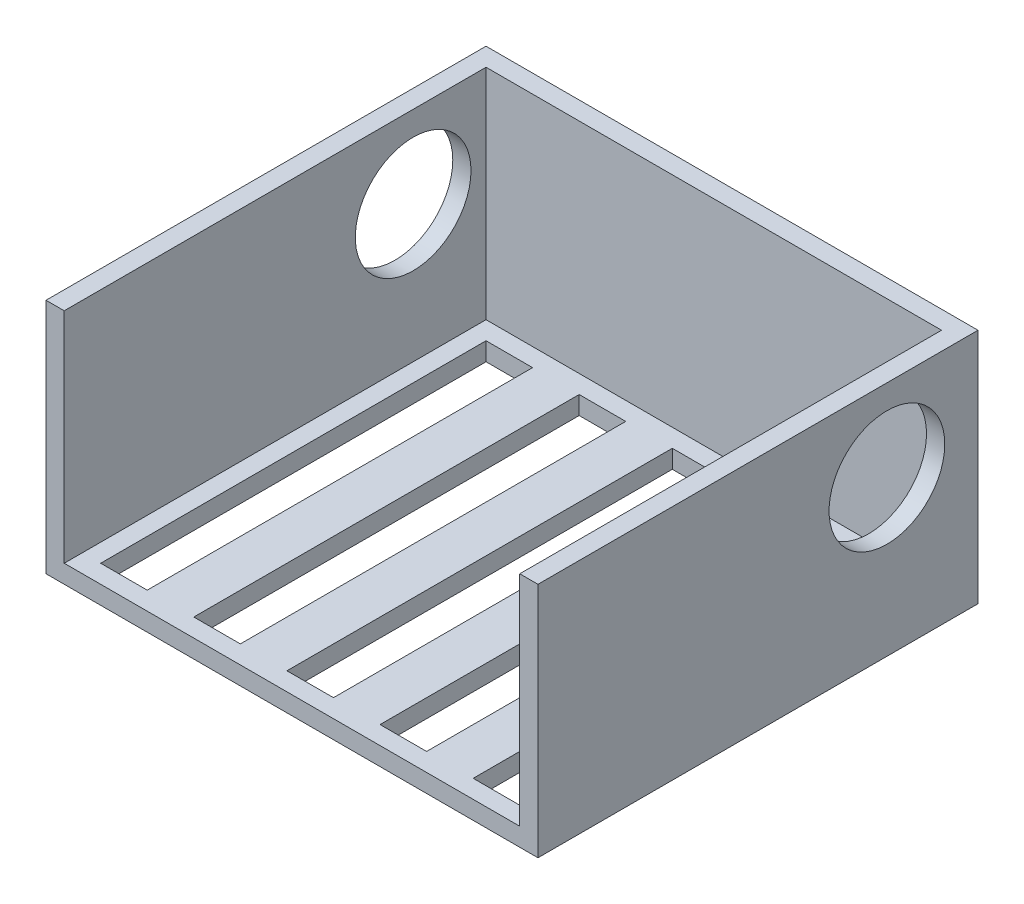
ISO-10303-21;
HEADER;
FILE_DESCRIPTION(('STEP AP214'),'2;1');
FILE_NAME('part.step','',(''),(''),'','','');
FILE_SCHEMA(('AUTOMOTIVE_DESIGN { 1 0 10303 214 1 1 1 1 }'));
ENDSEC;
DATA;
#1=APPLICATION_CONTEXT('core data for automotive mechanical design processes');
#2=APPLICATION_PROTOCOL_DEFINITION('international standard','automotive_design',2000,#1);
#3=PRODUCT_CONTEXT('',#1,'mechanical');
#4=PRODUCT('Part','Part','',(#3));
#5=PRODUCT_RELATED_PRODUCT_CATEGORY('part','',(#4));
#6=PRODUCT_DEFINITION_FORMATION('','',#4);
#7=PRODUCT_DEFINITION_CONTEXT('part definition',#1,'design');
#8=PRODUCT_DEFINITION('design','',#6,#7);
#9=PRODUCT_DEFINITION_SHAPE('','',#8);
#10=(LENGTH_UNIT() NAMED_UNIT(*) SI_UNIT(.MILLI.,.METRE.));
#11=(NAMED_UNIT(*) PLANE_ANGLE_UNIT() SI_UNIT($,.RADIAN.));
#12=(NAMED_UNIT(*) SI_UNIT($,.STERADIAN.) SOLID_ANGLE_UNIT());
#13=UNCERTAINTY_MEASURE_WITH_UNIT(LENGTH_MEASURE(1.E-05),#10,'distance_accuracy_value','');
#14=(GEOMETRIC_REPRESENTATION_CONTEXT(3) GLOBAL_UNCERTAINTY_ASSIGNED_CONTEXT((#13)) GLOBAL_UNIT_ASSIGNED_CONTEXT((#10,
#11,#12)) REPRESENTATION_CONTEXT('',''));
#15=CARTESIAN_POINT('',(0.,0.,0.));
#16=DIRECTION('',(0.,0.,1.));
#17=DIRECTION('',(1.,0.,0.));
#18=AXIS2_PLACEMENT_3D('',#15,#16,#17);
#19=CARTESIAN_POINT('',(0.,0.,0.));
#20=DIRECTION('',(0.,-1.,0.));
#21=DIRECTION('',(0.,0.,-1.));
#22=AXIS2_PLACEMENT_3D('',#19,#20,#21);
#23=PLANE('',#22);
#24=DIRECTION('',(0.,0.,1.));
#25=VECTOR('',#24,1.);
#26=CARTESIAN_POINT('',(-12.2222222222222,0.,0.));
#27=LINE('',#26,#25);
#28=CARTESIAN_POINT('',(-12.2222222222222,0.,2.));
#29=VERTEX_POINT('',#28);
#30=CARTESIAN_POINT('',(-12.2222222222222,0.,44.3));
#31=VERTEX_POINT('',#30);
#32=EDGE_CURVE('E433',#29,#31,#27,.T.);
#33=ORIENTED_EDGE('',*,*,#32,.T.);
#34=DIRECTION('',(1.,0.,0.));
#35=VECTOR('',#34,1.);
#36=CARTESIAN_POINT('',(0.,0.,44.3));
#37=LINE('',#36,#35);
#38=CARTESIAN_POINT('',(-17.3333333333334,0.,44.3));
#39=VERTEX_POINT('',#38);
#40=EDGE_CURVE('E413',#39,#31,#37,.T.);
#41=ORIENTED_EDGE('',*,*,#40,.F.);
#42=DIRECTION('',(0.,0.,1.));
#43=VECTOR('',#42,1.);
#44=CARTESIAN_POINT('',(-17.3333333333334,0.,0.));
#45=LINE('',#44,#43);
#46=CARTESIAN_POINT('',(-17.3333333333334,0.,2.));
#47=VERTEX_POINT('',#46);
#48=EDGE_CURVE('E425',#47,#39,#45,.T.);
#49=ORIENTED_EDGE('',*,*,#48,.F.);
#50=DIRECTION('',(-1.,0.,0.));
#51=VECTOR('',#50,1.);
#52=CARTESIAN_POINT('',(0.,0.,2.));
#53=LINE('',#52,#51);
#54=EDGE_CURVE('E429',#29,#47,#53,.T.);
#55=ORIENTED_EDGE('',*,*,#54,.F.);
#56=EDGE_LOOP('',(#33,#41,#49,#55));
#57=FACE_BOUND('',#56,.T.);
#58=DIRECTION('',(0.,0.,1.));
#59=VECTOR('',#58,1.);
#60=CARTESIAN_POINT('',(-50.,0.,0.));
#61=LINE('',#60,#59);
#62=CARTESIAN_POINT('',(-50.,0.,0.));
#63=VERTEX_POINT('',#62);
#64=CARTESIAN_POINT('',(-50.,0.,46.3));
#65=VERTEX_POINT('',#64);
#66=EDGE_CURVE('E491',#63,#65,#61,.T.);
#67=ORIENTED_EDGE('',*,*,#66,.T.);
#68=DIRECTION('',(1.,0.,0.));
#69=VECTOR('',#68,1.);
#70=CARTESIAN_POINT('',(0.,0.,46.3));
#71=LINE('',#70,#69);
#72=CARTESIAN_POINT('',(0.,0.,46.3));
#73=VERTEX_POINT('',#72);
#74=EDGE_CURVE('E476',#65,#73,#71,.T.);
#75=ORIENTED_EDGE('',*,*,#74,.T.);
#76=DIRECTION('',(0.,0.,-1.));
#77=VECTOR('',#76,1.);
#78=CARTESIAN_POINT('',(0.,0.,0.));
#79=LINE('',#78,#77);
#80=CARTESIAN_POINT('',(0.,0.,0.));
#81=VERTEX_POINT('',#80);
#82=EDGE_CURVE('E471',#73,#81,#79,.T.);
#83=ORIENTED_EDGE('',*,*,#82,.T.);
#84=DIRECTION('',(-1.,0.,0.));
#85=VECTOR('',#84,1.);
#86=CARTESIAN_POINT('',(0.,0.,0.));
#87=LINE('',#86,#85);
#88=EDGE_CURVE('E487',#81,#63,#87,.T.);
#89=ORIENTED_EDGE('',*,*,#88,.T.);
#90=EDGE_LOOP('',(#67,#75,#83,#89));
#91=FACE_BOUND('',#90,.T.);
#92=DIRECTION('',(0.,0.,1.));
#93=VECTOR('',#92,1.);
#94=CARTESIAN_POINT('',(-32.6666666666667,0.,0.));
#95=LINE('',#94,#93);
#96=CARTESIAN_POINT('',(-32.6666666666667,0.,2.));
#97=VERTEX_POINT('',#96);
#98=CARTESIAN_POINT('',(-32.6666666666667,0.,44.3));
#99=VERTEX_POINT('',#98);
#100=EDGE_CURVE('E390',#97,#99,#95,.T.);
#101=ORIENTED_EDGE('',*,*,#100,.T.);
#102=DIRECTION('',(1.,0.,0.));
#103=VECTOR('',#102,1.);
#104=CARTESIAN_POINT('',(0.,0.,44.3));
#105=LINE('',#104,#103);
#106=CARTESIAN_POINT('',(-37.7777777777778,0.,44.3));
#107=VERTEX_POINT('',#106);
#108=EDGE_CURVE('E370',#107,#99,#105,.T.);
#109=ORIENTED_EDGE('',*,*,#108,.F.);
#110=DIRECTION('',(0.,0.,1.));
#111=VECTOR('',#110,1.);
#112=CARTESIAN_POINT('',(-37.7777777777778,0.,0.));
#113=LINE('',#112,#111);
#114=CARTESIAN_POINT('',(-37.7777777777778,0.,2.));
#115=VERTEX_POINT('',#114);
#116=EDGE_CURVE('E382',#115,#107,#113,.T.);
#117=ORIENTED_EDGE('',*,*,#116,.F.);
#118=DIRECTION('',(-1.,0.,0.));
#119=VECTOR('',#118,1.);
#120=CARTESIAN_POINT('',(0.,0.,2.));
#121=LINE('',#120,#119);
#122=EDGE_CURVE('E386',#97,#115,#121,.T.);
#123=ORIENTED_EDGE('',*,*,#122,.F.);
#124=EDGE_LOOP('',(#101,#109,#117,#123));
#125=FACE_BOUND('',#124,.T.);
#126=DIRECTION('',(1.,0.,0.));
#127=VECTOR('',#126,1.);
#128=CARTESIAN_POINT('',(0.,0.,44.3));
#129=LINE('',#128,#127);
#130=CARTESIAN_POINT('',(-7.11111111111114,0.,44.3));
#131=VERTEX_POINT('',#130);
#132=CARTESIAN_POINT('',(-1.99999999999999,0.,44.3));
#133=VERTEX_POINT('',#132);
#134=EDGE_CURVE('E299',#131,#133,#129,.T.);
#135=ORIENTED_EDGE('',*,*,#134,.F.);
#136=DIRECTION('',(0.,0.,1.));
#137=VECTOR('',#136,1.);
#138=CARTESIAN_POINT('',(-7.11111111111114,0.,0.));
#139=LINE('',#138,#137);
#140=CARTESIAN_POINT('',(-7.11111111111114,0.,2.));
#141=VERTEX_POINT('',#140);
#142=EDGE_CURVE('E303',#141,#131,#139,.T.);
#143=ORIENTED_EDGE('',*,*,#142,.F.);
#144=DIRECTION('',(-1.,0.,0.));
#145=VECTOR('',#144,1.);
#146=CARTESIAN_POINT('',(0.,0.,2.));
#147=LINE('',#146,#145);
#148=CARTESIAN_POINT('',(-2.,0.,2.));
#149=VERTEX_POINT('',#148);
#150=EDGE_CURVE('E283',#149,#141,#147,.T.);
#151=ORIENTED_EDGE('',*,*,#150,.F.);
#152=DIRECTION('',(0.,0.,-1.));
#153=VECTOR('',#152,1.);
#154=CARTESIAN_POINT('',(-2.,0.,0.));
#155=LINE('',#154,#153);
#156=EDGE_CURVE('E295',#133,#149,#155,.T.);
#157=ORIENTED_EDGE('',*,*,#156,.F.);
#158=EDGE_LOOP('',(#135,#143,#151,#157));
#159=FACE_BOUND('',#158,.T.);
#160=DIRECTION('',(0.,0.,1.));
#161=VECTOR('',#160,1.);
#162=CARTESIAN_POINT('',(-27.5555555555556,0.,2.));
#163=LINE('',#162,#161);
#164=CARTESIAN_POINT('',(-27.5555555555556,0.,2.));
#165=VERTEX_POINT('',#164);
#166=CARTESIAN_POINT('',(-27.5555555555556,0.,44.3));
#167=VERTEX_POINT('',#166);
#168=EDGE_CURVE('E344',#165,#167,#163,.T.);
#169=ORIENTED_EDGE('',*,*,#168,.F.);
#170=DIRECTION('',(-1.,0.,0.));
#171=VECTOR('',#170,1.);
#172=CARTESIAN_POINT('',(-22.4444444444445,0.,2.));
#173=LINE('',#172,#171);
#174=CARTESIAN_POINT('',(-22.4444444444445,0.,2.));
#175=VERTEX_POINT('',#174);
#176=EDGE_CURVE('E62',#175,#165,#173,.T.);
#177=ORIENTED_EDGE('',*,*,#176,.F.);
#178=DIRECTION('',(0.,0.,1.));
#179=VECTOR('',#178,1.);
#180=CARTESIAN_POINT('',(-22.4444444444445,0.,2.));
#181=LINE('',#180,#179);
#182=CARTESIAN_POINT('',(-22.4444444444445,0.,44.3));
#183=VERTEX_POINT('',#182);
#184=EDGE_CURVE('E328',#175,#183,#181,.T.);
#185=ORIENTED_EDGE('',*,*,#184,.T.);
#186=DIRECTION('',(1.,0.,0.));
#187=VECTOR('',#186,1.);
#188=CARTESIAN_POINT('',(-27.5555555555556,0.,44.3));
#189=LINE('',#188,#187);
#190=EDGE_CURVE('E340',#167,#183,#189,.T.);
#191=ORIENTED_EDGE('',*,*,#190,.F.);
#192=EDGE_LOOP('',(#169,#177,#185,#191));
#193=FACE_BOUND('',#192,.T.);
#194=DIRECTION('',(1.,0.,0.));
#195=VECTOR('',#194,1.);
#196=CARTESIAN_POINT('',(0.,0.,2.));
#197=LINE('',#196,#195);
#198=CARTESIAN_POINT('',(-48.,0.,2.00000000000001));
#199=VERTEX_POINT('',#198);
#200=CARTESIAN_POINT('',(-42.8888888888889,0.,2.00000000000001));
#201=VERTEX_POINT('',#200);
#202=EDGE_CURVE('E54',#199,#201,#197,.T.);
#203=ORIENTED_EDGE('',*,*,#202,.T.);
#204=DIRECTION('',(0.,0.,1.));
#205=VECTOR('',#204,1.);
#206=CARTESIAN_POINT('',(-42.8888888888889,0.,0.));
#207=LINE('',#206,#205);
#208=CARTESIAN_POINT('',(-42.8888888888889,0.,44.3));
#209=VERTEX_POINT('',#208);
#210=EDGE_CURVE('E242',#201,#209,#207,.T.);
#211=ORIENTED_EDGE('',*,*,#210,.T.);
#212=DIRECTION('',(1.,0.,0.));
#213=VECTOR('',#212,1.);
#214=CARTESIAN_POINT('',(0.,0.,44.3));
#215=LINE('',#214,#213);
#216=CARTESIAN_POINT('',(-48.,0.,44.3));
#217=VERTEX_POINT('',#216);
#218=EDGE_CURVE('E259',#217,#209,#215,.T.);
#219=ORIENTED_EDGE('',*,*,#218,.F.);
#220=DIRECTION('',(0.,0.,1.));
#221=VECTOR('',#220,1.);
#222=CARTESIAN_POINT('',(-48.,0.,0.));
#223=LINE('',#222,#221);
#224=EDGE_CURVE('E251',#199,#217,#223,.T.);
#225=ORIENTED_EDGE('',*,*,#224,.F.);
#226=EDGE_LOOP('',(#203,#211,#219,#225));
#227=FACE_BOUND('',#226,.T.);
#228=ADVANCED_FACE('F37',(#57,#91,#125,#159,#193,#227),#23,.F.);
#229=CARTESIAN_POINT('',(0.,-2.,0.));
#230=DIRECTION('',(0.,-1.,0.));
#231=DIRECTION('',(0.,0.,-1.));
#232=AXIS2_PLACEMENT_3D('',#229,#230,#231);
#233=PLANE('',#232);
#234=DIRECTION('',(-1.,0.,0.));
#235=VECTOR('',#234,1.);
#236=CARTESIAN_POINT('',(-22.4444444444445,-2.,2.));
#237=LINE('',#236,#235);
#238=CARTESIAN_POINT('',(-22.4444444444445,-2.,2.));
#239=VERTEX_POINT('',#238);
#240=CARTESIAN_POINT('',(-27.5555555555556,-2.,2.));
#241=VERTEX_POINT('',#240);
#242=EDGE_CURVE('E350',#239,#241,#237,.T.);
#243=ORIENTED_EDGE('',*,*,#242,.T.);
#244=DIRECTION('',(0.,0.,1.));
#245=VECTOR('',#244,1.);
#246=CARTESIAN_POINT('',(-27.5555555555556,-2.,2.));
#247=LINE('',#246,#245);
#248=CARTESIAN_POINT('',(-27.5555555555556,-2.,44.3));
#249=VERTEX_POINT('',#248);
#250=EDGE_CURVE('E319',#241,#249,#247,.T.);
#251=ORIENTED_EDGE('',*,*,#250,.T.);
#252=DIRECTION('',(1.,0.,0.));
#253=VECTOR('',#252,1.);
#254=CARTESIAN_POINT('',(-27.5555555555556,-2.,44.3));
#255=LINE('',#254,#253);
#256=CARTESIAN_POINT('',(-22.4444444444445,-2.,44.3));
#257=VERTEX_POINT('',#256);
#258=EDGE_CURVE('E278',#249,#257,#255,.T.);
#259=ORIENTED_EDGE('',*,*,#258,.T.);
#260=DIRECTION('',(0.,0.,1.));
#261=VECTOR('',#260,1.);
#262=CARTESIAN_POINT('',(-22.4444444444445,-2.,2.));
#263=LINE('',#262,#261);
#264=EDGE_CURVE('E354',#239,#257,#263,.T.);
#265=ORIENTED_EDGE('',*,*,#264,.F.);
#266=EDGE_LOOP('',(#243,#251,#259,#265));
#267=FACE_BOUND('',#266,.T.);
#268=DIRECTION('',(0.,0.,1.));
#269=VECTOR('',#268,1.);
#270=CARTESIAN_POINT('',(-7.11111111111114,-2.,0.));
#271=LINE('',#270,#269);
#272=CARTESIAN_POINT('',(-7.11111111111114,-2.,2.));
#273=VERTEX_POINT('',#272);
#274=CARTESIAN_POINT('',(-7.11111111111114,-2.,44.3));
#275=VERTEX_POINT('',#274);
#276=EDGE_CURVE('E306',#273,#275,#271,.T.);
#277=ORIENTED_EDGE('',*,*,#276,.T.);
#278=DIRECTION('',(1.,0.,0.));
#279=VECTOR('',#278,1.);
#280=CARTESIAN_POINT('',(0.,-2.,44.3));
#281=LINE('',#280,#279);
#282=CARTESIAN_POINT('',(-1.99999999999999,-2.,44.3));
#283=VERTEX_POINT('',#282);
#284=EDGE_CURVE('E273',#275,#283,#281,.T.);
#285=ORIENTED_EDGE('',*,*,#284,.T.);
#286=DIRECTION('',(0.,0.,-1.));
#287=VECTOR('',#286,1.);
#288=CARTESIAN_POINT('',(-2.,-2.,0.));
#289=LINE('',#288,#287);
#290=CARTESIAN_POINT('',(-2.,-2.,2.));
#291=VERTEX_POINT('',#290);
#292=EDGE_CURVE('E314',#283,#291,#289,.T.);
#293=ORIENTED_EDGE('',*,*,#292,.T.);
#294=DIRECTION('',(-1.,0.,0.));
#295=VECTOR('',#294,1.);
#296=CARTESIAN_POINT('',(0.,-2.,2.));
#297=LINE('',#296,#295);
#298=EDGE_CURVE('E310',#291,#273,#297,.T.);
#299=ORIENTED_EDGE('',*,*,#298,.T.);
#300=EDGE_LOOP('',(#277,#285,#293,#299));
#301=FACE_BOUND('',#300,.T.);
#302=DIRECTION('',(-1.,0.,0.));
#303=VECTOR('',#302,1.);
#304=CARTESIAN_POINT('',(28.0768096208106,-2.,46.3));
#305=LINE('',#304,#303);
#306=CARTESIAN_POINT('',(2.00000000000001,-2.,46.3));
#307=VERTEX_POINT('',#306);
#308=CARTESIAN_POINT('',(-52.,-2.,46.3));
#309=VERTEX_POINT('',#308);
#310=EDGE_CURVE('E450',#307,#309,#305,.T.);
#311=ORIENTED_EDGE('',*,*,#310,.T.);
#312=DIRECTION('',(0.,0.,-1.));
#313=VECTOR('',#312,1.);
#314=CARTESIAN_POINT('',(-52.,-2.,48.3));
#315=LINE('',#314,#313);
#316=CARTESIAN_POINT('',(-52.,-2.,-1.99999999999999));
#317=VERTEX_POINT('',#316);
#318=EDGE_CURVE('E468',#309,#317,#315,.T.);
#319=ORIENTED_EDGE('',*,*,#318,.T.);
#320=DIRECTION('',(1.,0.,0.));
#321=VECTOR('',#320,1.);
#322=CARTESIAN_POINT('',(-52.,-2.,-1.99999999999999));
#323=LINE('',#322,#321);
#324=CARTESIAN_POINT('',(2.,-2.,-2.));
#325=VERTEX_POINT('',#324);
#326=EDGE_CURVE('E460',#317,#325,#323,.T.);
#327=ORIENTED_EDGE('',*,*,#326,.T.);
#328=DIRECTION('',(0.,0.,1.));
#329=VECTOR('',#328,1.);
#330=CARTESIAN_POINT('',(2.,-2.,-2.));
#331=LINE('',#330,#329);
#332=EDGE_CURVE('E464',#325,#307,#331,.T.);
#333=ORIENTED_EDGE('',*,*,#332,.T.);
#334=EDGE_LOOP('',(#311,#319,#327,#333));
#335=FACE_BOUND('',#334,.T.);
#336=DIRECTION('',(1.,0.,0.));
#337=VECTOR('',#336,1.);
#338=CARTESIAN_POINT('',(0.,-2.,44.3));
#339=LINE('',#338,#337);
#340=CARTESIAN_POINT('',(-37.7777777777778,-2.,44.3));
#341=VERTEX_POINT('',#340);
#342=CARTESIAN_POINT('',(-32.6666666666667,-2.,44.3));
#343=VERTEX_POINT('',#342);
#344=EDGE_CURVE('E397',#341,#343,#339,.T.);
#345=ORIENTED_EDGE('',*,*,#344,.T.);
#346=DIRECTION('',(0.,0.,1.));
#347=VECTOR('',#346,1.);
#348=CARTESIAN_POINT('',(-32.6666666666667,-2.,0.));
#349=LINE('',#348,#347);
#350=CARTESIAN_POINT('',(-32.6666666666667,-2.,2.));
#351=VERTEX_POINT('',#350);
#352=EDGE_CURVE('E394',#351,#343,#349,.T.);
#353=ORIENTED_EDGE('',*,*,#352,.F.);
#354=DIRECTION('',(-1.,0.,0.));
#355=VECTOR('',#354,1.);
#356=CARTESIAN_POINT('',(0.,-2.,2.));
#357=LINE('',#356,#355);
#358=CARTESIAN_POINT('',(-37.7777777777778,-2.,2.));
#359=VERTEX_POINT('',#358);
#360=EDGE_CURVE('E360',#351,#359,#357,.T.);
#361=ORIENTED_EDGE('',*,*,#360,.T.);
#362=DIRECTION('',(0.,0.,1.));
#363=VECTOR('',#362,1.);
#364=CARTESIAN_POINT('',(-37.7777777777778,-2.,0.));
#365=LINE('',#364,#363);
#366=EDGE_CURVE('E401',#359,#341,#365,.T.);
#367=ORIENTED_EDGE('',*,*,#366,.T.);
#368=EDGE_LOOP('',(#345,#353,#361,#367));
#369=FACE_BOUND('',#368,.T.);
#370=DIRECTION('',(1.,0.,0.));
#371=VECTOR('',#370,1.);
#372=CARTESIAN_POINT('',(0.,-2.,44.3));
#373=LINE('',#372,#371);
#374=CARTESIAN_POINT('',(-17.3333333333334,-2.,44.3));
#375=VERTEX_POINT('',#374);
#376=CARTESIAN_POINT('',(-12.2222222222222,-2.,44.3));
#377=VERTEX_POINT('',#376);
#378=EDGE_CURVE('E440',#375,#377,#373,.T.);
#379=ORIENTED_EDGE('',*,*,#378,.T.);
#380=DIRECTION('',(0.,0.,1.));
#381=VECTOR('',#380,1.);
#382=CARTESIAN_POINT('',(-12.2222222222222,-2.,0.));
#383=LINE('',#382,#381);
#384=CARTESIAN_POINT('',(-12.2222222222222,-2.,2.));
#385=VERTEX_POINT('',#384);
#386=EDGE_CURVE('E437',#385,#377,#383,.T.);
#387=ORIENTED_EDGE('',*,*,#386,.F.);
#388=DIRECTION('',(-1.,0.,0.));
#389=VECTOR('',#388,1.);
#390=CARTESIAN_POINT('',(0.,-2.,2.));
#391=LINE('',#390,#389);
#392=CARTESIAN_POINT('',(-17.3333333333334,-2.,2.));
#393=VERTEX_POINT('',#392);
#394=EDGE_CURVE('E318',#385,#393,#391,.T.);
#395=ORIENTED_EDGE('',*,*,#394,.T.);
#396=DIRECTION('',(0.,0.,1.));
#397=VECTOR('',#396,1.);
#398=CARTESIAN_POINT('',(-17.3333333333334,-2.,0.));
#399=LINE('',#398,#397);
#400=EDGE_CURVE('E365',#393,#375,#399,.T.);
#401=ORIENTED_EDGE('',*,*,#400,.T.);
#402=EDGE_LOOP('',(#379,#387,#395,#401));
#403=FACE_BOUND('',#402,.T.);
#404=DIRECTION('',(0.,0.,1.));
#405=VECTOR('',#404,1.);
#406=CARTESIAN_POINT('',(-42.8888888888889,-2.,0.));
#407=LINE('',#406,#405);
#408=CARTESIAN_POINT('',(-42.8888888888889,-2.,2.00000000000001));
#409=VERTEX_POINT('',#408);
#410=CARTESIAN_POINT('',(-42.8888888888889,-2.,44.3));
#411=VERTEX_POINT('',#410);
#412=EDGE_CURVE('E246',#409,#411,#407,.T.);
#413=ORIENTED_EDGE('',*,*,#412,.F.);
#414=DIRECTION('',(1.,0.,0.));
#415=VECTOR('',#414,1.);
#416=CARTESIAN_POINT('',(0.,-2.,2.));
#417=LINE('',#416,#415);
#418=CARTESIAN_POINT('',(-48.,-2.,2.00000000000001));
#419=VERTEX_POINT('',#418);
#420=EDGE_CURVE('E239',#419,#409,#417,.T.);
#421=ORIENTED_EDGE('',*,*,#420,.F.);
#422=DIRECTION('',(0.,0.,1.));
#423=VECTOR('',#422,1.);
#424=CARTESIAN_POINT('',(-48.,-2.,0.));
#425=LINE('',#424,#423);
#426=CARTESIAN_POINT('',(-48.,-2.,44.3));
#427=VERTEX_POINT('',#426);
#428=EDGE_CURVE('E224',#419,#427,#425,.T.);
#429=ORIENTED_EDGE('',*,*,#428,.T.);
#430=DIRECTION('',(1.,0.,0.));
#431=VECTOR('',#430,1.);
#432=CARTESIAN_POINT('',(0.,-2.,44.3));
#433=LINE('',#432,#431);
#434=EDGE_CURVE('E253',#427,#411,#433,.T.);
#435=ORIENTED_EDGE('',*,*,#434,.T.);
#436=EDGE_LOOP('',(#413,#421,#429,#435));
#437=FACE_BOUND('',#436,.T.);
#438=ADVANCED_FACE('F245',(#267,#301,#335,#369,#403,#437),#233,.T.);
#439=CARTESIAN_POINT('',(0.,24.,0.));
#440=DIRECTION('',(0.,-1.,0.));
#441=DIRECTION('',(0.,0.,-1.));
#442=AXIS2_PLACEMENT_3D('',#439,#440,#441);
#443=PLANE('',#442);
#444=DIRECTION('',(0.,0.,1.));
#445=VECTOR('',#444,1.);
#446=CARTESIAN_POINT('',(-52.,24.,-1.99999999999999));
#447=LINE('',#446,#445);
#448=CARTESIAN_POINT('',(-52.,24.,-1.99999999999999));
#449=VERTEX_POINT('',#448);
#450=CARTESIAN_POINT('',(-52.,24.,46.3));
#451=VERTEX_POINT('',#450);
#452=EDGE_CURVE('E517',#449,#451,#447,.T.);
#453=ORIENTED_EDGE('',*,*,#452,.T.);
#454=DIRECTION('',(-1.,0.,0.));
#455=VECTOR('',#454,1.);
#456=CARTESIAN_POINT('',(28.0768096208106,24.,46.3));
#457=LINE('',#456,#455);
#458=CARTESIAN_POINT('',(-50.,24.,46.3));
#459=VERTEX_POINT('',#458);
#460=EDGE_CURVE('E449',#459,#451,#457,.T.);
#461=ORIENTED_EDGE('',*,*,#460,.F.);
#462=DIRECTION('',(0.,0.,1.));
#463=VECTOR('',#462,1.);
#464=CARTESIAN_POINT('',(-50.,24.,0.));
#465=LINE('',#464,#463);
#466=CARTESIAN_POINT('',(-50.,24.,0.));
#467=VERTEX_POINT('',#466);
#468=EDGE_CURVE('E479',#467,#459,#465,.T.);
#469=ORIENTED_EDGE('',*,*,#468,.F.);
#470=DIRECTION('',(-1.,0.,0.));
#471=VECTOR('',#470,1.);
#472=CARTESIAN_POINT('',(0.,24.,0.));
#473=LINE('',#472,#471);
#474=CARTESIAN_POINT('',(0.,24.,0.));
#475=VERTEX_POINT('',#474);
#476=EDGE_CURVE('E475',#475,#467,#473,.T.);
#477=ORIENTED_EDGE('',*,*,#476,.F.);
#478=DIRECTION('',(0.,0.,-1.));
#479=VECTOR('',#478,1.);
#480=CARTESIAN_POINT('',(0.,24.,0.));
#481=LINE('',#480,#479);
#482=CARTESIAN_POINT('',(0.,24.,46.3));
#483=VERTEX_POINT('',#482);
#484=EDGE_CURVE('E472',#483,#475,#481,.T.);
#485=ORIENTED_EDGE('',*,*,#484,.F.);
#486=CARTESIAN_POINT('',(2.00000000000001,24.,46.3));
#487=VERTEX_POINT('',#486);
#488=EDGE_CURVE('E455',#487,#483,#457,.T.);
#489=ORIENTED_EDGE('',*,*,#488,.F.);
#490=DIRECTION('',(0.,0.,-1.));
#491=VECTOR('',#490,1.);
#492=CARTESIAN_POINT('',(2.,24.,-2.));
#493=LINE('',#492,#491);
#494=CARTESIAN_POINT('',(2.,24.,-2.));
#495=VERTEX_POINT('',#494);
#496=EDGE_CURVE('E511',#487,#495,#493,.T.);
#497=ORIENTED_EDGE('',*,*,#496,.T.);
#498=DIRECTION('',(-1.,0.,0.));
#499=VECTOR('',#498,1.);
#500=CARTESIAN_POINT('',(2.,24.,-2.));
#501=LINE('',#500,#499);
#502=EDGE_CURVE('E514',#495,#449,#501,.T.);
#503=ORIENTED_EDGE('',*,*,#502,.T.);
#504=EDGE_LOOP('',(#453,#461,#469,#477,#485,#489,#497,#503));
#505=FACE_BOUND('',#504,.T.);
#506=ADVANCED_FACE('F544',(#505),#443,.F.);
#507=CARTESIAN_POINT('',(2.,24.,-2.));
#508=DIRECTION('',(-1.,0.,0.));
#509=DIRECTION('',(0.,0.,1.));
#510=AXIS2_PLACEMENT_3D('',#507,#508,#509);
#511=PLANE('',#510);
#512=CARTESIAN_POINT('',(2.00000000000001,15.,8.));
#513=DIRECTION('',(1.,0.,0.));
#514=DIRECTION('',(0.,0.,-1.));
#515=AXIS2_PLACEMENT_3D('',#512,#513,#514);
#516=CIRCLE('',#515,6.35);
#517=CARTESIAN_POINT('',(2.00000000000001,15.,1.65));
#518=VERTEX_POINT('',#517);
#519=EDGE_CURVE('E675',#518,#518,#516,.T.);
#520=ORIENTED_EDGE('',*,*,#519,.F.);
#521=EDGE_LOOP('',(#520));
#522=FACE_BOUND('',#521,.T.);
#523=ORIENTED_EDGE('',*,*,#496,.F.);
#524=DIRECTION('',(0.,1.,0.));
#525=VECTOR('',#524,1.);
#526=CARTESIAN_POINT('',(2.00000000000001,0.,46.3));
#527=LINE('',#526,#525);
#528=EDGE_CURVE('E454',#307,#487,#527,.T.);
#529=ORIENTED_EDGE('',*,*,#528,.F.);
#530=ORIENTED_EDGE('',*,*,#332,.F.);
#531=DIRECTION('',(0.,-1.,0.));
#532=VECTOR('',#531,1.);
#533=CARTESIAN_POINT('',(2.,24.,-2.));
#534=LINE('',#533,#532);
#535=EDGE_CURVE('E11',#495,#325,#534,.T.);
#536=ORIENTED_EDGE('',*,*,#535,.F.);
#537=EDGE_LOOP('',(#523,#529,#530,#536));
#538=FACE_BOUND('',#537,.T.);
#539=ADVANCED_FACE('F39',(#522,#538),#511,.F.);
#540=CARTESIAN_POINT('',(2.,24.,-2.));
#541=DIRECTION('',(0.,0.,1.));
#542=DIRECTION('',(1.,0.,0.));
#543=AXIS2_PLACEMENT_3D('',#540,#541,#542);
#544=PLANE('',#543);
#545=ORIENTED_EDGE('',*,*,#535,.T.);
#546=ORIENTED_EDGE('',*,*,#326,.F.);
#547=DIRECTION('',(0.,-1.,0.));
#548=VECTOR('',#547,1.);
#549=CARTESIAN_POINT('',(-52.,24.,-1.99999999999999));
#550=LINE('',#549,#548);
#551=EDGE_CURVE('E47',#449,#317,#550,.T.);
#552=ORIENTED_EDGE('',*,*,#551,.F.);
#553=ORIENTED_EDGE('',*,*,#502,.F.);
#554=EDGE_LOOP('',(#545,#546,#552,#553));
#555=FACE_BOUND('',#554,.T.);
#556=ADVANCED_FACE('F532',(#555),#544,.F.);
#557=CARTESIAN_POINT('',(-52.,24.,-1.99999999999999));
#558=DIRECTION('',(1.,0.,0.));
#559=DIRECTION('',(0.,0.,-1.));
#560=AXIS2_PLACEMENT_3D('',#557,#558,#559);
#561=PLANE('',#560);
#562=CARTESIAN_POINT('',(-52.,15.,8.00000000000001));
#563=DIRECTION('',(1.,0.,0.));
#564=DIRECTION('',(0.,0.,-1.));
#565=AXIS2_PLACEMENT_3D('',#562,#563,#564);
#566=CIRCLE('',#565,6.35);
#567=CARTESIAN_POINT('',(-52.,15.,1.65000000000001));
#568=VERTEX_POINT('',#567);
#569=EDGE_CURVE('E672',#568,#568,#566,.T.);
#570=ORIENTED_EDGE('',*,*,#569,.T.);
#571=EDGE_LOOP('',(#570));
#572=FACE_BOUND('',#571,.T.);
#573=ORIENTED_EDGE('',*,*,#318,.F.);
#574=DIRECTION('',(0.,-1.,0.));
#575=VECTOR('',#574,1.);
#576=CARTESIAN_POINT('',(-52.,0.,46.3));
#577=LINE('',#576,#575);
#578=EDGE_CURVE('E235',#451,#309,#577,.T.);
#579=ORIENTED_EDGE('',*,*,#578,.F.);
#580=ORIENTED_EDGE('',*,*,#452,.F.);
#581=ORIENTED_EDGE('',*,*,#551,.T.);
#582=EDGE_LOOP('',(#573,#579,#580,#581));
#583=FACE_BOUND('',#582,.T.);
#584=ADVANCED_FACE('F528',(#572,#583),#561,.F.);
#585=CARTESIAN_POINT('',(0.,24.,0.));
#586=DIRECTION('',(-1.,0.,0.));
#587=DIRECTION('',(0.,0.,1.));
#588=AXIS2_PLACEMENT_3D('',#585,#586,#587);
#589=PLANE('',#588);
#590=CARTESIAN_POINT('',(0.,15.,8.));
#591=DIRECTION('',(-1.,0.,0.));
#592=DIRECTION('',(0.,0.,1.));
#593=AXIS2_PLACEMENT_3D('',#590,#591,#592);
#594=CIRCLE('',#593,6.35);
#595=CARTESIAN_POINT('',(0.,15.,14.35));
#596=VERTEX_POINT('',#595);
#597=EDGE_CURVE('E324',#596,#596,#594,.T.);
#598=ORIENTED_EDGE('',*,*,#597,.F.);
#599=EDGE_LOOP('',(#598));
#600=FACE_BOUND('',#599,.T.);
#601=ORIENTED_EDGE('',*,*,#82,.F.);
#602=DIRECTION('',(0.,-1.,0.));
#603=VECTOR('',#602,1.);
#604=CARTESIAN_POINT('',(0.,24.,46.3));
#605=LINE('',#604,#603);
#606=EDGE_CURVE('E483',#483,#73,#605,.T.);
#607=ORIENTED_EDGE('',*,*,#606,.F.);
#608=ORIENTED_EDGE('',*,*,#484,.T.);
#609=DIRECTION('',(0.,-1.,0.));
#610=VECTOR('',#609,1.);
#611=CARTESIAN_POINT('',(0.,24.,0.));
#612=LINE('',#611,#610);
#613=EDGE_CURVE('E507',#475,#81,#612,.T.);
#614=ORIENTED_EDGE('',*,*,#613,.T.);
#615=EDGE_LOOP('',(#601,#607,#608,#614));
#616=FACE_BOUND('',#615,.T.);
#617=ADVANCED_FACE('F550',(#600,#616),#589,.T.);
#618=CARTESIAN_POINT('',(0.,24.,0.));
#619=DIRECTION('',(0.,0.,1.));
#620=DIRECTION('',(1.,0.,0.));
#621=AXIS2_PLACEMENT_3D('',#618,#619,#620);
#622=PLANE('',#621);
#623=ORIENTED_EDGE('',*,*,#88,.F.);
#624=ORIENTED_EDGE('',*,*,#613,.F.);
#625=ORIENTED_EDGE('',*,*,#476,.T.);
#626=DIRECTION('',(0.,-1.,0.));
#627=VECTOR('',#626,1.);
#628=CARTESIAN_POINT('',(-50.,24.,0.));
#629=LINE('',#628,#627);
#630=EDGE_CURVE('E504',#467,#63,#629,.T.);
#631=ORIENTED_EDGE('',*,*,#630,.T.);
#632=EDGE_LOOP('',(#623,#624,#625,#631));
#633=FACE_BOUND('',#632,.T.);
#634=ADVANCED_FACE('F562',(#633),#622,.T.);
#635=CARTESIAN_POINT('',(-50.,24.,0.));
#636=DIRECTION('',(1.,0.,0.));
#637=DIRECTION('',(0.,0.,-1.));
#638=AXIS2_PLACEMENT_3D('',#635,#636,#637);
#639=PLANE('',#638);
#640=CARTESIAN_POINT('',(-50.,15.,8.00000000000001));
#641=DIRECTION('',(1.,0.,0.));
#642=DIRECTION('',(0.,0.,-1.));
#643=AXIS2_PLACEMENT_3D('',#640,#641,#642);
#644=CIRCLE('',#643,6.35);
#645=CARTESIAN_POINT('',(-50.,15.,1.65000000000001));
#646=VERTEX_POINT('',#645);
#647=EDGE_CURVE('E41',#646,#646,#644,.T.);
#648=ORIENTED_EDGE('',*,*,#647,.F.);
#649=EDGE_LOOP('',(#648));
#650=FACE_BOUND('',#649,.T.);
#651=ORIENTED_EDGE('',*,*,#66,.F.);
#652=ORIENTED_EDGE('',*,*,#630,.F.);
#653=ORIENTED_EDGE('',*,*,#468,.T.);
#654=DIRECTION('',(0.,-1.,0.));
#655=VECTOR('',#654,1.);
#656=CARTESIAN_POINT('',(-50.,24.,46.3));
#657=LINE('',#656,#655);
#658=EDGE_CURVE('E500',#459,#65,#657,.T.);
#659=ORIENTED_EDGE('',*,*,#658,.T.);
#660=EDGE_LOOP('',(#651,#652,#653,#659));
#661=FACE_BOUND('',#660,.T.);
#662=ADVANCED_FACE('F557',(#650,#661),#639,.T.);
#663=CARTESIAN_POINT('',(28.0768096208106,0.,46.3));
#664=DIRECTION('',(0.,0.,-1.));
#665=DIRECTION('',(-1.,0.,0.));
#666=AXIS2_PLACEMENT_3D('',#663,#664,#665);
#667=PLANE('',#666);
#668=ORIENTED_EDGE('',*,*,#606,.T.);
#669=ORIENTED_EDGE('',*,*,#74,.F.);
#670=ORIENTED_EDGE('',*,*,#658,.F.);
#671=ORIENTED_EDGE('',*,*,#460,.T.);
#672=ORIENTED_EDGE('',*,*,#578,.T.);
#673=ORIENTED_EDGE('',*,*,#310,.F.);
#674=ORIENTED_EDGE('',*,*,#528,.T.);
#675=ORIENTED_EDGE('',*,*,#488,.T.);
#676=EDGE_LOOP('',(#668,#669,#670,#671,#672,#673,#674,#675));
#677=FACE_BOUND('',#676,.T.);
#678=ADVANCED_FACE('F539',(#677),#667,.F.);
#679=CARTESIAN_POINT('',(-32.6666666666667,-2.001,0.));
#680=DIRECTION('',(-1.,0.,0.));
#681=DIRECTION('',(0.,0.,1.));
#682=AXIS2_PLACEMENT_3D('',#679,#680,#681);
#683=PLANE('',#682);
#684=ORIENTED_EDGE('',*,*,#352,.T.);
#685=DIRECTION('',(0.,1.,0.));
#686=VECTOR('',#685,1.);
#687=CARTESIAN_POINT('',(-32.6666666666667,-2.001,44.3));
#688=LINE('',#687,#686);
#689=EDGE_CURVE('E364',#343,#99,#688,.T.);
#690=ORIENTED_EDGE('',*,*,#689,.T.);
#691=ORIENTED_EDGE('',*,*,#100,.F.);
#692=DIRECTION('',(0.,1.,0.));
#693=VECTOR('',#692,1.);
#694=CARTESIAN_POINT('',(-32.6666666666667,-2.001,2.));
#695=LINE('',#694,#693);
#696=EDGE_CURVE('E366',#351,#97,#695,.T.);
#697=ORIENTED_EDGE('',*,*,#696,.F.);
#698=EDGE_LOOP('',(#684,#690,#691,#697));
#699=FACE_BOUND('',#698,.T.);
#700=ADVANCED_FACE('F584',(#699),#683,.T.);
#701=CARTESIAN_POINT('',(0.,-2.001,44.3));
#702=DIRECTION('',(0.,0.,1.));
#703=DIRECTION('',(1.,0.,0.));
#704=AXIS2_PLACEMENT_3D('',#701,#702,#703);
#705=PLANE('',#704);
#706=DIRECTION('',(0.,1.,0.));
#707=VECTOR('',#706,1.);
#708=CARTESIAN_POINT('',(-37.7777777777778,-2.001,44.3));
#709=LINE('',#708,#707);
#710=EDGE_CURVE('E374',#341,#107,#709,.T.);
#711=ORIENTED_EDGE('',*,*,#710,.T.);
#712=ORIENTED_EDGE('',*,*,#108,.T.);
#713=ORIENTED_EDGE('',*,*,#689,.F.);
#714=ORIENTED_EDGE('',*,*,#344,.F.);
#715=EDGE_LOOP('',(#711,#712,#713,#714));
#716=FACE_BOUND('',#715,.T.);
#717=ADVANCED_FACE('F603',(#716),#705,.F.);
#718=CARTESIAN_POINT('',(-37.7777777777778,-2.001,0.));
#719=DIRECTION('',(-1.,0.,0.));
#720=DIRECTION('',(0.,0.,1.));
#721=AXIS2_PLACEMENT_3D('',#718,#719,#720);
#722=PLANE('',#721);
#723=DIRECTION('',(0.,1.,0.));
#724=VECTOR('',#723,1.);
#725=CARTESIAN_POINT('',(-37.7777777777778,-2.001,2.));
#726=LINE('',#725,#724);
#727=EDGE_CURVE('E371',#359,#115,#726,.T.);
#728=ORIENTED_EDGE('',*,*,#727,.T.);
#729=ORIENTED_EDGE('',*,*,#116,.T.);
#730=ORIENTED_EDGE('',*,*,#710,.F.);
#731=ORIENTED_EDGE('',*,*,#366,.F.);
#732=EDGE_LOOP('',(#728,#729,#730,#731));
#733=FACE_BOUND('',#732,.T.);
#734=ADVANCED_FACE('F606',(#733),#722,.F.);
#735=CARTESIAN_POINT('',(0.,-2.001,2.));
#736=DIRECTION('',(0.,0.,-1.));
#737=DIRECTION('',(-1.,0.,0.));
#738=AXIS2_PLACEMENT_3D('',#735,#736,#737);
#739=PLANE('',#738);
#740=ORIENTED_EDGE('',*,*,#696,.T.);
#741=ORIENTED_EDGE('',*,*,#122,.T.);
#742=ORIENTED_EDGE('',*,*,#727,.F.);
#743=ORIENTED_EDGE('',*,*,#360,.F.);
#744=EDGE_LOOP('',(#740,#741,#742,#743));
#745=FACE_BOUND('',#744,.T.);
#746=ADVANCED_FACE('F601',(#745),#739,.F.);
#747=CARTESIAN_POINT('',(-12.2222222222222,-2.001,0.));
#748=DIRECTION('',(-1.,0.,0.));
#749=DIRECTION('',(0.,0.,1.));
#750=AXIS2_PLACEMENT_3D('',#747,#748,#749);
#751=PLANE('',#750);
#752=ORIENTED_EDGE('',*,*,#386,.T.);
#753=DIRECTION('',(0.,1.,0.));
#754=VECTOR('',#753,1.);
#755=CARTESIAN_POINT('',(-12.2222222222222,-2.001,44.3));
#756=LINE('',#755,#754);
#757=EDGE_CURVE('E408',#377,#31,#756,.T.);
#758=ORIENTED_EDGE('',*,*,#757,.T.);
#759=ORIENTED_EDGE('',*,*,#32,.F.);
#760=DIRECTION('',(0.,1.,0.));
#761=VECTOR('',#760,1.);
#762=CARTESIAN_POINT('',(-12.2222222222222,-2.001,2.));
#763=LINE('',#762,#761);
#764=EDGE_CURVE('E409',#385,#29,#763,.T.);
#765=ORIENTED_EDGE('',*,*,#764,.F.);
#766=EDGE_LOOP('',(#752,#758,#759,#765));
#767=FACE_BOUND('',#766,.T.);
#768=ADVANCED_FACE('F589',(#767),#751,.T.);
#769=CARTESIAN_POINT('',(0.,-2.001,44.3));
#770=DIRECTION('',(0.,0.,1.));
#771=DIRECTION('',(1.,0.,0.));
#772=AXIS2_PLACEMENT_3D('',#769,#770,#771);
#773=PLANE('',#772);
#774=DIRECTION('',(0.,1.,0.));
#775=VECTOR('',#774,1.);
#776=CARTESIAN_POINT('',(-17.3333333333334,-2.001,44.3));
#777=LINE('',#776,#775);
#778=EDGE_CURVE('E417',#375,#39,#777,.T.);
#779=ORIENTED_EDGE('',*,*,#778,.T.);
#780=ORIENTED_EDGE('',*,*,#40,.T.);
#781=ORIENTED_EDGE('',*,*,#757,.F.);
#782=ORIENTED_EDGE('',*,*,#378,.F.);
#783=EDGE_LOOP('',(#779,#780,#781,#782));
#784=FACE_BOUND('',#783,.T.);
#785=ADVANCED_FACE('F585',(#784),#773,.F.);
#786=CARTESIAN_POINT('',(-17.3333333333334,-2.001,0.));
#787=DIRECTION('',(-1.,0.,0.));
#788=DIRECTION('',(0.,0.,1.));
#789=AXIS2_PLACEMENT_3D('',#786,#787,#788);
#790=PLANE('',#789);
#791=DIRECTION('',(0.,1.,0.));
#792=VECTOR('',#791,1.);
#793=CARTESIAN_POINT('',(-17.3333333333334,-2.001,2.));
#794=LINE('',#793,#792);
#795=EDGE_CURVE('E414',#393,#47,#794,.T.);
#796=ORIENTED_EDGE('',*,*,#795,.T.);
#797=ORIENTED_EDGE('',*,*,#48,.T.);
#798=ORIENTED_EDGE('',*,*,#778,.F.);
#799=ORIENTED_EDGE('',*,*,#400,.F.);
#800=EDGE_LOOP('',(#796,#797,#798,#799));
#801=FACE_BOUND('',#800,.T.);
#802=ADVANCED_FACE('F588',(#801),#790,.F.);
#803=CARTESIAN_POINT('',(0.,-2.001,2.));
#804=DIRECTION('',(0.,0.,-1.));
#805=DIRECTION('',(-1.,0.,0.));
#806=AXIS2_PLACEMENT_3D('',#803,#804,#805);
#807=PLANE('',#806);
#808=ORIENTED_EDGE('',*,*,#764,.T.);
#809=ORIENTED_EDGE('',*,*,#54,.T.);
#810=ORIENTED_EDGE('',*,*,#795,.F.);
#811=ORIENTED_EDGE('',*,*,#394,.F.);
#812=EDGE_LOOP('',(#808,#809,#810,#811));
#813=FACE_BOUND('',#812,.T.);
#814=ADVANCED_FACE('F593',(#813),#807,.F.);
#815=CARTESIAN_POINT('',(-7.11111111111114,-2.001,0.));
#816=DIRECTION('',(-1.,0.,0.));
#817=DIRECTION('',(0.,0.,1.));
#818=AXIS2_PLACEMENT_3D('',#815,#816,#817);
#819=PLANE('',#818);
#820=DIRECTION('',(0.,1.,0.));
#821=VECTOR('',#820,1.);
#822=CARTESIAN_POINT('',(-7.11111111111114,-2.001,2.));
#823=LINE('',#822,#821);
#824=EDGE_CURVE('E277',#273,#141,#823,.T.);
#825=ORIENTED_EDGE('',*,*,#824,.T.);
#826=ORIENTED_EDGE('',*,*,#142,.T.);
#827=DIRECTION('',(0.,1.,0.));
#828=VECTOR('',#827,1.);
#829=CARTESIAN_POINT('',(-7.11111111111114,-2.001,44.3));
#830=LINE('',#829,#828);
#831=EDGE_CURVE('E279',#275,#131,#830,.T.);
#832=ORIENTED_EDGE('',*,*,#831,.F.);
#833=ORIENTED_EDGE('',*,*,#276,.F.);
#834=EDGE_LOOP('',(#825,#826,#832,#833));
#835=FACE_BOUND('',#834,.T.);
#836=ADVANCED_FACE('F597',(#835),#819,.F.);
#837=CARTESIAN_POINT('',(0.,-2.001,2.));
#838=DIRECTION('',(0.,0.,-1.));
#839=DIRECTION('',(-1.,0.,0.));
#840=AXIS2_PLACEMENT_3D('',#837,#838,#839);
#841=PLANE('',#840);
#842=DIRECTION('',(0.,1.,0.));
#843=VECTOR('',#842,1.);
#844=CARTESIAN_POINT('',(-2.,-2.001,2.));
#845=LINE('',#844,#843);
#846=EDGE_CURVE('E287',#291,#149,#845,.T.);
#847=ORIENTED_EDGE('',*,*,#846,.T.);
#848=ORIENTED_EDGE('',*,*,#150,.T.);
#849=ORIENTED_EDGE('',*,*,#824,.F.);
#850=ORIENTED_EDGE('',*,*,#298,.F.);
#851=EDGE_LOOP('',(#847,#848,#849,#850));
#852=FACE_BOUND('',#851,.T.);
#853=ADVANCED_FACE('F633',(#852),#841,.F.);
#854=CARTESIAN_POINT('',(-2.,-2.001,0.));
#855=DIRECTION('',(1.,0.,0.));
#856=DIRECTION('',(0.,0.,-1.));
#857=AXIS2_PLACEMENT_3D('',#854,#855,#856);
#858=PLANE('',#857);
#859=DIRECTION('',(0.,1.,0.));
#860=VECTOR('',#859,1.);
#861=CARTESIAN_POINT('',(-1.99999999999999,-2.001,44.3));
#862=LINE('',#861,#860);
#863=EDGE_CURVE('E284',#283,#133,#862,.T.);
#864=ORIENTED_EDGE('',*,*,#863,.T.);
#865=ORIENTED_EDGE('',*,*,#156,.T.);
#866=ORIENTED_EDGE('',*,*,#846,.F.);
#867=ORIENTED_EDGE('',*,*,#292,.F.);
#868=EDGE_LOOP('',(#864,#865,#866,#867));
#869=FACE_BOUND('',#868,.T.);
#870=ADVANCED_FACE('F636',(#869),#858,.F.);
#871=CARTESIAN_POINT('',(0.,-2.001,44.3));
#872=DIRECTION('',(0.,0.,1.));
#873=DIRECTION('',(1.,0.,0.));
#874=AXIS2_PLACEMENT_3D('',#871,#872,#873);
#875=PLANE('',#874);
#876=ORIENTED_EDGE('',*,*,#831,.T.);
#877=ORIENTED_EDGE('',*,*,#134,.T.);
#878=ORIENTED_EDGE('',*,*,#863,.F.);
#879=ORIENTED_EDGE('',*,*,#284,.F.);
#880=EDGE_LOOP('',(#876,#877,#878,#879));
#881=FACE_BOUND('',#880,.T.);
#882=ADVANCED_FACE('F632',(#881),#875,.F.);
#883=CARTESIAN_POINT('',(-22.4444444444445,-2.001,2.));
#884=DIRECTION('',(0.,0.,-1.));
#885=DIRECTION('',(-1.,0.,0.));
#886=AXIS2_PLACEMENT_3D('',#883,#884,#885);
#887=PLANE('',#886);
#888=DIRECTION('',(0.,1.,0.));
#889=VECTOR('',#888,1.);
#890=CARTESIAN_POINT('',(-22.4444444444445,-2.001,2.));
#891=LINE('',#890,#889);
#892=EDGE_CURVE('E323',#239,#175,#891,.T.);
#893=ORIENTED_EDGE('',*,*,#892,.T.);
#894=ORIENTED_EDGE('',*,*,#176,.T.);
#895=DIRECTION('',(0.,1.,0.));
#896=VECTOR('',#895,1.);
#897=CARTESIAN_POINT('',(-27.5555555555556,-2.001,2.));
#898=LINE('',#897,#896);
#899=EDGE_CURVE('E325',#241,#165,#898,.T.);
#900=ORIENTED_EDGE('',*,*,#899,.F.);
#901=ORIENTED_EDGE('',*,*,#242,.F.);
#902=EDGE_LOOP('',(#893,#894,#900,#901));
#903=FACE_BOUND('',#902,.T.);
#904=ADVANCED_FACE('F621',(#903),#887,.F.);
#905=CARTESIAN_POINT('',(-22.4444444444445,-2.001,2.));
#906=DIRECTION('',(-1.,0.,0.));
#907=DIRECTION('',(0.,0.,1.));
#908=AXIS2_PLACEMENT_3D('',#905,#906,#907);
#909=PLANE('',#908);
#910=ORIENTED_EDGE('',*,*,#264,.T.);
#911=DIRECTION('',(0.,1.,0.));
#912=VECTOR('',#911,1.);
#913=CARTESIAN_POINT('',(-22.4444444444445,-2.001,44.3));
#914=LINE('',#913,#912);
#915=EDGE_CURVE('E332',#257,#183,#914,.T.);
#916=ORIENTED_EDGE('',*,*,#915,.T.);
#917=ORIENTED_EDGE('',*,*,#184,.F.);
#918=ORIENTED_EDGE('',*,*,#892,.F.);
#919=EDGE_LOOP('',(#910,#916,#917,#918));
#920=FACE_BOUND('',#919,.T.);
#921=ADVANCED_FACE('F617',(#920),#909,.T.);
#922=CARTESIAN_POINT('',(-27.5555555555556,-2.001,44.3));
#923=DIRECTION('',(0.,0.,1.));
#924=DIRECTION('',(1.,0.,0.));
#925=AXIS2_PLACEMENT_3D('',#922,#923,#924);
#926=PLANE('',#925);
#927=DIRECTION('',(0.,1.,0.));
#928=VECTOR('',#927,1.);
#929=CARTESIAN_POINT('',(-27.5555555555556,-2.001,44.3));
#930=LINE('',#929,#928);
#931=EDGE_CURVE('E329',#249,#167,#930,.T.);
#932=ORIENTED_EDGE('',*,*,#931,.T.);
#933=ORIENTED_EDGE('',*,*,#190,.T.);
#934=ORIENTED_EDGE('',*,*,#915,.F.);
#935=ORIENTED_EDGE('',*,*,#258,.F.);
#936=EDGE_LOOP('',(#932,#933,#934,#935));
#937=FACE_BOUND('',#936,.T.);
#938=ADVANCED_FACE('F620',(#937),#926,.F.);
#939=CARTESIAN_POINT('',(-27.5555555555556,-2.001,2.));
#940=DIRECTION('',(-1.,0.,0.));
#941=DIRECTION('',(0.,0.,1.));
#942=AXIS2_PLACEMENT_3D('',#939,#940,#941);
#943=PLANE('',#942);
#944=ORIENTED_EDGE('',*,*,#899,.T.);
#945=ORIENTED_EDGE('',*,*,#168,.T.);
#946=ORIENTED_EDGE('',*,*,#931,.F.);
#947=ORIENTED_EDGE('',*,*,#250,.F.);
#948=EDGE_LOOP('',(#944,#945,#946,#947));
#949=FACE_BOUND('',#948,.T.);
#950=ADVANCED_FACE('F625',(#949),#943,.F.);
#951=CARTESIAN_POINT('',(0.,-2.001,2.));
#952=DIRECTION('',(0.,0.,1.));
#953=DIRECTION('',(1.,0.,0.));
#954=AXIS2_PLACEMENT_3D('',#951,#952,#953);
#955=PLANE('',#954);
#956=ORIENTED_EDGE('',*,*,#420,.T.);
#957=DIRECTION('',(0.,1.,0.));
#958=VECTOR('',#957,1.);
#959=CARTESIAN_POINT('',(-42.8888888888889,-2.001,2.00000000000001));
#960=LINE('',#959,#958);
#961=EDGE_CURVE('E236',#409,#201,#960,.T.);
#962=ORIENTED_EDGE('',*,*,#961,.T.);
#963=ORIENTED_EDGE('',*,*,#202,.F.);
#964=DIRECTION('',(0.,1.,0.));
#965=VECTOR('',#964,1.);
#966=CARTESIAN_POINT('',(-48.,-2.001,2.00000000000001));
#967=LINE('',#966,#965);
#968=EDGE_CURVE('E227',#419,#199,#967,.T.);
#969=ORIENTED_EDGE('',*,*,#968,.F.);
#970=EDGE_LOOP('',(#956,#962,#963,#969));
#971=FACE_BOUND('',#970,.T.);
#972=ADVANCED_FACE('F238',(#971),#955,.T.);
#973=CARTESIAN_POINT('',(-42.8888888888889,-2.001,0.));
#974=DIRECTION('',(-1.,0.,0.));
#975=DIRECTION('',(0.,0.,1.));
#976=AXIS2_PLACEMENT_3D('',#973,#974,#975);
#977=PLANE('',#976);
#978=ORIENTED_EDGE('',*,*,#412,.T.);
#979=DIRECTION('',(0.,1.,0.));
#980=VECTOR('',#979,1.);
#981=CARTESIAN_POINT('',(-42.8888888888889,-2.001,44.3));
#982=LINE('',#981,#980);
#983=EDGE_CURVE('E268',#411,#209,#982,.T.);
#984=ORIENTED_EDGE('',*,*,#983,.T.);
#985=ORIENTED_EDGE('',*,*,#210,.F.);
#986=ORIENTED_EDGE('',*,*,#961,.F.);
#987=EDGE_LOOP('',(#978,#984,#985,#986));
#988=FACE_BOUND('',#987,.T.);
#989=ADVANCED_FACE('F649',(#988),#977,.T.);
#990=CARTESIAN_POINT('',(0.,-2.001,44.3));
#991=DIRECTION('',(0.,0.,1.));
#992=DIRECTION('',(1.,0.,0.));
#993=AXIS2_PLACEMENT_3D('',#990,#991,#992);
#994=PLANE('',#993);
#995=DIRECTION('',(0.,1.,0.));
#996=VECTOR('',#995,1.);
#997=CARTESIAN_POINT('',(-48.,-2.001,44.3));
#998=LINE('',#997,#996);
#999=EDGE_CURVE('E229',#427,#217,#998,.T.);
#1000=ORIENTED_EDGE('',*,*,#999,.T.);
#1001=ORIENTED_EDGE('',*,*,#218,.T.);
#1002=ORIENTED_EDGE('',*,*,#983,.F.);
#1003=ORIENTED_EDGE('',*,*,#434,.F.);
#1004=EDGE_LOOP('',(#1000,#1001,#1002,#1003));
#1005=FACE_BOUND('',#1004,.T.);
#1006=ADVANCED_FACE('F653',(#1005),#994,.F.);
#1007=CARTESIAN_POINT('',(-48.,-2.001,0.));
#1008=DIRECTION('',(-1.,0.,0.));
#1009=DIRECTION('',(0.,0.,1.));
#1010=AXIS2_PLACEMENT_3D('',#1007,#1008,#1009);
#1011=PLANE('',#1010);
#1012=ORIENTED_EDGE('',*,*,#968,.T.);
#1013=ORIENTED_EDGE('',*,*,#224,.T.);
#1014=ORIENTED_EDGE('',*,*,#999,.F.);
#1015=ORIENTED_EDGE('',*,*,#428,.F.);
#1016=EDGE_LOOP('',(#1012,#1013,#1014,#1015));
#1017=FACE_BOUND('',#1016,.T.);
#1018=ADVANCED_FACE('F225',(#1017),#1011,.F.);
#1019=CARTESIAN_POINT('',(-52.,15.,8.00000000000001));
#1020=DIRECTION('',(1.,0.,0.));
#1021=DIRECTION('',(0.,0.,-1.));
#1022=AXIS2_PLACEMENT_3D('',#1019,#1020,#1021);
#1023=CYLINDRICAL_SURFACE('',#1022,6.35);
#1024=ORIENTED_EDGE('',*,*,#647,.T.);
#1025=EDGE_LOOP('',(#1024));
#1026=FACE_BOUND('',#1025,.T.);
#1027=ORIENTED_EDGE('',*,*,#569,.F.);
#1028=EDGE_LOOP('',(#1027));
#1029=FACE_BOUND('',#1028,.T.);
#1030=ADVANCED_FACE('F652',(#1026,#1029),#1023,.F.);
#1031=ORIENTED_EDGE('',*,*,#597,.T.);
#1032=EDGE_LOOP('',(#1031));
#1033=FACE_BOUND('',#1032,.T.);
#1034=ORIENTED_EDGE('',*,*,#519,.T.);
#1035=EDGE_LOOP('',(#1034));
#1036=FACE_BOUND('',#1035,.T.);
#1037=ADVANCED_FACE('F661',(#1033,#1036),#1023,.F.);
#1038=CLOSED_SHELL('',(#228,#438,#506,#539,#556,#584,#617,#634,#662,#678,#700,#717,#734,#746,
#768,#785,#802,#814,#836,#853,#870,#882,#904,#921,#938,#950,#972,#989,#1006,#1018,#1030,#1037));
#1039=MANIFOLD_SOLID_BREP('B2',#1038);
#1040=ADVANCED_BREP_SHAPE_REPRESENTATION('',(#18,#1039),#14);
#1041=SHAPE_DEFINITION_REPRESENTATION(#9,#1040);
ENDSEC;
END-ISO-10303-21;
